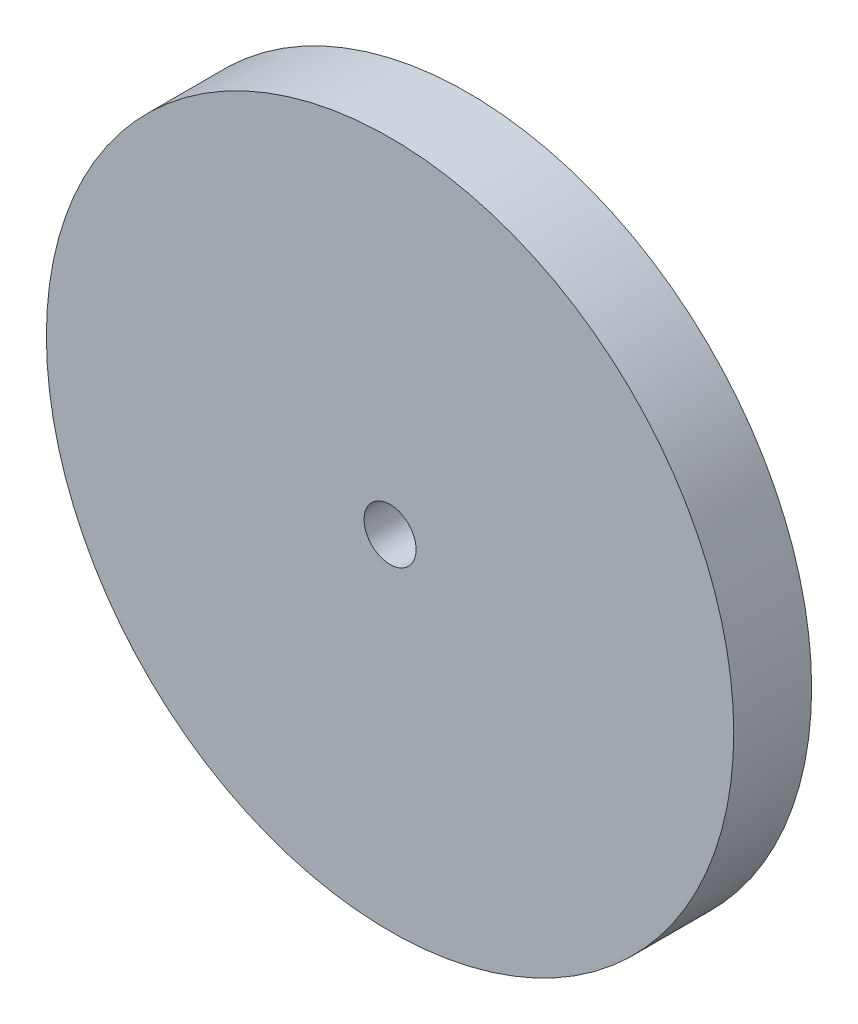
ISO-10303-21;
HEADER;
FILE_DESCRIPTION(('STEP AP214'),'2;1');
FILE_NAME('part.step','',(''),(''),'','','');
FILE_SCHEMA(('AUTOMOTIVE_DESIGN { 1 0 10303 214 1 1 1 1 }'));
ENDSEC;
DATA;
#1=APPLICATION_CONTEXT('core data for automotive mechanical design processes');
#2=APPLICATION_PROTOCOL_DEFINITION('international standard','automotive_design',2000,#1);
#3=PRODUCT_CONTEXT('',#1,'mechanical');
#4=PRODUCT('Part','Part','',(#3));
#5=PRODUCT_RELATED_PRODUCT_CATEGORY('part','',(#4));
#6=PRODUCT_DEFINITION_FORMATION('','',#4);
#7=PRODUCT_DEFINITION_CONTEXT('part definition',#1,'design');
#8=PRODUCT_DEFINITION('design','',#6,#7);
#9=PRODUCT_DEFINITION_SHAPE('','',#8);
#10=(LENGTH_UNIT() NAMED_UNIT(*) SI_UNIT(.MILLI.,.METRE.));
#11=(NAMED_UNIT(*) PLANE_ANGLE_UNIT() SI_UNIT($,.RADIAN.));
#12=(NAMED_UNIT(*) SI_UNIT($,.STERADIAN.) SOLID_ANGLE_UNIT());
#13=UNCERTAINTY_MEASURE_WITH_UNIT(LENGTH_MEASURE(1.E-05),#10,'distance_accuracy_value','');
#14=(GEOMETRIC_REPRESENTATION_CONTEXT(3) GLOBAL_UNCERTAINTY_ASSIGNED_CONTEXT((#13)) GLOBAL_UNIT_ASSIGNED_CONTEXT((#10,
#11,#12)) REPRESENTATION_CONTEXT('',''));
#15=CARTESIAN_POINT('',(0.,0.,0.));
#16=DIRECTION('',(0.,0.,1.));
#17=DIRECTION('',(1.,0.,0.));
#18=AXIS2_PLACEMENT_3D('',#15,#16,#17);
#19=CARTESIAN_POINT('',(0.,0.,5.588));
#20=DIRECTION('',(0.,0.,1.));
#21=DIRECTION('',(1.,0.,0.));
#22=AXIS2_PLACEMENT_3D('',#19,#20,#21);
#23=PLANE('',#22);
#24=CARTESIAN_POINT('',(0.,0.,5.588));
#25=DIRECTION('',(0.,0.,1.));
#26=DIRECTION('',(1.,0.,0.));
#27=AXIS2_PLACEMENT_3D('',#24,#25,#26);
#28=CIRCLE('',#27,24.66826923);
#29=CARTESIAN_POINT('',(24.66826923,0.,5.588));
#30=VERTEX_POINT('',#29);
#31=EDGE_CURVE('E10',#30,#30,#28,.T.);
#32=ORIENTED_EDGE('',*,*,#31,.T.);
#33=EDGE_LOOP('',(#32));
#34=FACE_BOUND('',#33,.T.);
#35=CARTESIAN_POINT('',(0.,0.,5.588));
#36=DIRECTION('',(0.,0.,1.));
#37=DIRECTION('',(1.,0.,0.));
#38=AXIS2_PLACEMENT_3D('',#35,#36,#37);
#39=CIRCLE('',#38,1.8669);
#40=CARTESIAN_POINT('',(1.8669,0.,5.588));
#41=VERTEX_POINT('',#40);
#42=EDGE_CURVE('E46',#41,#41,#39,.T.);
#43=ORIENTED_EDGE('',*,*,#42,.F.);
#44=EDGE_LOOP('',(#43));
#45=FACE_BOUND('',#44,.T.);
#46=ADVANCED_FACE('F35',(#34,#45),#23,.T.);
#47=CARTESIAN_POINT('',(0.,0.,0.));
#48=DIRECTION('',(0.,0.,1.));
#49=DIRECTION('',(1.,0.,0.));
#50=AXIS2_PLACEMENT_3D('',#47,#48,#49);
#51=PLANE('',#50);
#52=CARTESIAN_POINT('',(0.,0.,0.));
#53=DIRECTION('',(0.,0.,1.));
#54=DIRECTION('',(1.,0.,0.));
#55=AXIS2_PLACEMENT_3D('',#52,#53,#54);
#56=CIRCLE('',#55,24.66826923);
#57=CARTESIAN_POINT('',(24.66826923,0.,0.));
#58=VERTEX_POINT('',#57);
#59=EDGE_CURVE('E39',#58,#58,#56,.T.);
#60=ORIENTED_EDGE('',*,*,#59,.F.);
#61=EDGE_LOOP('',(#60));
#62=FACE_BOUND('',#61,.T.);
#63=CARTESIAN_POINT('',(0.,0.,0.));
#64=DIRECTION('',(0.,0.,1.));
#65=DIRECTION('',(1.,0.,0.));
#66=AXIS2_PLACEMENT_3D('',#63,#64,#65);
#67=CIRCLE('',#66,1.8669);
#68=CARTESIAN_POINT('',(1.8669,0.,0.));
#69=VERTEX_POINT('',#68);
#70=EDGE_CURVE('E48',#69,#69,#67,.T.);
#71=ORIENTED_EDGE('',*,*,#70,.T.);
#72=EDGE_LOOP('',(#71));
#73=FACE_BOUND('',#72,.T.);
#74=ADVANCED_FACE('F58',(#62,#73),#51,.F.);
#75=CARTESIAN_POINT('',(0.,0.,5.588));
#76=DIRECTION('',(0.,0.,-1.));
#77=DIRECTION('',(-1.,0.,0.));
#78=AXIS2_PLACEMENT_3D('',#75,#76,#77);
#79=CYLINDRICAL_SURFACE('',#78,24.66826923);
#80=ORIENTED_EDGE('',*,*,#31,.F.);
#81=EDGE_LOOP('',(#80));
#82=FACE_BOUND('',#81,.T.);
#83=ORIENTED_EDGE('',*,*,#59,.T.);
#84=EDGE_LOOP('',(#83));
#85=FACE_BOUND('',#84,.T.);
#86=ADVANCED_FACE('F37',(#82,#85),#79,.T.);
#87=CARTESIAN_POINT('',(0.,0.,5.588));
#88=DIRECTION('',(0.,0.,-1.));
#89=DIRECTION('',(-1.,0.,0.));
#90=AXIS2_PLACEMENT_3D('',#87,#88,#89);
#91=CYLINDRICAL_SURFACE('',#90,1.8669);
#92=ORIENTED_EDGE('',*,*,#42,.T.);
#93=EDGE_LOOP('',(#92));
#94=FACE_BOUND('',#93,.T.);
#95=ORIENTED_EDGE('',*,*,#70,.F.);
#96=EDGE_LOOP('',(#95));
#97=FACE_BOUND('',#96,.T.);
#98=ADVANCED_FACE('F54',(#94,#97),#91,.F.);
#99=CLOSED_SHELL('',(#46,#74,#86,#98));
#100=MANIFOLD_SOLID_BREP('B2',#99);
#101=ADVANCED_BREP_SHAPE_REPRESENTATION('',(#18,#100),#14);
#102=SHAPE_DEFINITION_REPRESENTATION(#9,#101);
ENDSEC;
END-ISO-10303-21;
